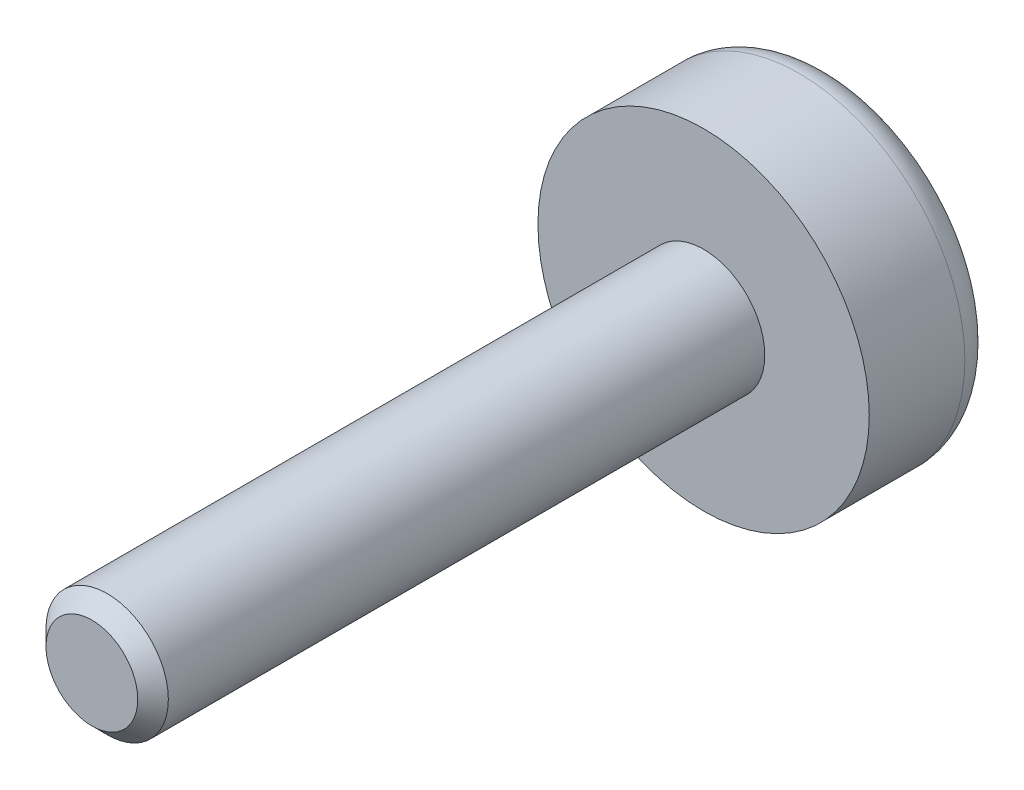
ISO-10303-21;
HEADER;
FILE_DESCRIPTION(('STEP AP214'),'2;1');
FILE_NAME('part.step','',(''),(''),'','','');
FILE_SCHEMA(('AUTOMOTIVE_DESIGN { 1 0 10303 214 1 1 1 1 }'));
ENDSEC;
DATA;
#1=APPLICATION_CONTEXT('core data for automotive mechanical design processes');
#2=APPLICATION_PROTOCOL_DEFINITION('international standard','automotive_design',2000,#1);
#3=PRODUCT_CONTEXT('',#1,'mechanical');
#4=PRODUCT('Part','Part','',(#3));
#5=PRODUCT_RELATED_PRODUCT_CATEGORY('part','',(#4));
#6=PRODUCT_DEFINITION_FORMATION('','',#4);
#7=PRODUCT_DEFINITION_CONTEXT('part definition',#1,'design');
#8=PRODUCT_DEFINITION('design','',#6,#7);
#9=PRODUCT_DEFINITION_SHAPE('','',#8);
#10=(LENGTH_UNIT() NAMED_UNIT(*) SI_UNIT(.MILLI.,.METRE.));
#11=(NAMED_UNIT(*) PLANE_ANGLE_UNIT() SI_UNIT($,.RADIAN.));
#12=(NAMED_UNIT(*) SI_UNIT($,.STERADIAN.) SOLID_ANGLE_UNIT());
#13=UNCERTAINTY_MEASURE_WITH_UNIT(LENGTH_MEASURE(1.E-05),#10,'distance_accuracy_value','');
#14=(GEOMETRIC_REPRESENTATION_CONTEXT(3) GLOBAL_UNCERTAINTY_ASSIGNED_CONTEXT((#13)) GLOBAL_UNIT_ASSIGNED_CONTEXT((#10,
#11,#12)) REPRESENTATION_CONTEXT('',''));
#15=CARTESIAN_POINT('',(0.,0.,0.));
#16=DIRECTION('',(0.,0.,1.));
#17=DIRECTION('',(1.,0.,0.));
#18=AXIS2_PLACEMENT_3D('',#15,#16,#17);
#19=CARTESIAN_POINT('',(0.,0.,12.));
#20=DIRECTION('',(0.,0.,1.));
#21=DIRECTION('',(-1.,0.,0.));
#22=AXIS2_PLACEMENT_3D('',#19,#20,#21);
#23=PLANE('',#22);
#24=CARTESIAN_POINT('',(0.,0.,12.));
#25=DIRECTION('',(0.,0.,-1.));
#26=DIRECTION('',(-1.,0.,0.));
#27=AXIS2_PLACEMENT_3D('',#24,#25,#26);
#28=CIRCLE('',#27,0.899999999999995);
#29=CARTESIAN_POINT('',(0.899999999999993,0.,12.));
#30=VERTEX_POINT('',#29);
#31=EDGE_CURVE('E140',#30,#30,#28,.T.);
#32=ORIENTED_EDGE('',*,*,#31,.F.);
#33=EDGE_LOOP('',(#32));
#34=FACE_BOUND('',#33,.T.);
#35=ADVANCED_FACE('F41',(#34),#23,.T.);
#36=CARTESIAN_POINT('',(0.,0.,-10.123));
#37=DIRECTION('',(0.,0.,-1.));
#38=DIRECTION('',(1.,0.,0.));
#39=AXIS2_PLACEMENT_3D('',#36,#37,#38);
#40=CYLINDRICAL_SURFACE('',#39,1.2);
#41=CARTESIAN_POINT('',(0.,0.,11.7));
#42=DIRECTION('',(0.,0.,-1.));
#43=DIRECTION('',(-1.,0.,0.));
#44=AXIS2_PLACEMENT_3D('',#41,#42,#43);
#45=CIRCLE('',#44,1.2);
#46=CARTESIAN_POINT('',(1.2,0.,11.7));
#47=VERTEX_POINT('',#46);
#48=EDGE_CURVE('E137',#47,#47,#45,.F.);
#49=ORIENTED_EDGE('',*,*,#48,.F.);
#50=EDGE_LOOP('',(#49));
#51=FACE_BOUND('',#50,.T.);
#52=CARTESIAN_POINT('',(0.,0.,0.));
#53=DIRECTION('',(0.,0.,1.));
#54=DIRECTION('',(1.,0.,0.));
#55=AXIS2_PLACEMENT_3D('',#52,#53,#54);
#56=CIRCLE('',#55,1.2);
#57=CARTESIAN_POINT('',(1.2,0.,0.));
#58=VERTEX_POINT('',#57);
#59=EDGE_CURVE('E134',#58,#58,#56,.T.);
#60=ORIENTED_EDGE('',*,*,#59,.T.);
#61=EDGE_LOOP('',(#60));
#62=FACE_BOUND('',#61,.T.);
#63=ADVANCED_FACE('F163',(#51,#62),#40,.T.);
#64=CARTESIAN_POINT('',(1.2,0.,0.));
#65=DIRECTION('',(0.,0.,1.));
#66=DIRECTION('',(-1.,0.,0.));
#67=AXIS2_PLACEMENT_3D('',#64,#65,#66);
#68=PLANE('',#67);
#69=ORIENTED_EDGE('',*,*,#59,.F.);
#70=EDGE_LOOP('',(#69));
#71=FACE_BOUND('',#70,.T.);
#72=CARTESIAN_POINT('',(0.,0.,0.));
#73=DIRECTION('',(0.,0.,1.));
#74=DIRECTION('',(1.,0.,0.));
#75=AXIS2_PLACEMENT_3D('',#72,#73,#74);
#76=CIRCLE('',#75,3.25);
#77=CARTESIAN_POINT('',(3.25,0.,0.));
#78=VERTEX_POINT('',#77);
#79=EDGE_CURVE('E131',#78,#78,#76,.T.);
#80=ORIENTED_EDGE('',*,*,#79,.T.);
#81=EDGE_LOOP('',(#80));
#82=FACE_BOUND('',#81,.T.);
#83=ADVANCED_FACE('F157',(#71,#82),#68,.T.);
#84=CARTESIAN_POINT('',(0.,0.,-10.123));
#85=DIRECTION('',(0.,0.,-1.));
#86=DIRECTION('',(1.,0.,0.));
#87=AXIS2_PLACEMENT_3D('',#84,#85,#86);
#88=CYLINDRICAL_SURFACE('',#87,3.25);
#89=CARTESIAN_POINT('',(0.,0.,-1.875));
#90=DIRECTION('',(0.,0.,1.));
#91=DIRECTION('',(1.,0.,0.));
#92=AXIS2_PLACEMENT_3D('',#89,#90,#91);
#93=CIRCLE('',#92,3.25);
#94=CARTESIAN_POINT('',(3.25,0.,-1.875));
#95=VERTEX_POINT('',#94);
#96=EDGE_CURVE('E11',#95,#95,#93,.F.);
#97=ORIENTED_EDGE('',*,*,#96,.F.);
#98=EDGE_LOOP('',(#97));
#99=FACE_BOUND('',#98,.T.);
#100=ORIENTED_EDGE('',*,*,#79,.F.);
#101=EDGE_LOOP('',(#100));
#102=FACE_BOUND('',#101,.T.);
#103=ADVANCED_FACE('F149',(#99,#102),#88,.T.);
#104=CARTESIAN_POINT('',(3.25,0.,-2.5));
#105=DIRECTION('',(0.,0.,-1.));
#106=DIRECTION('',(1.,0.,0.));
#107=AXIS2_PLACEMENT_3D('',#104,#105,#106);
#108=PLANE('',#107);
#109=DIRECTION('',(0.499999999999995,0.866025403784441,0.));
#110=VECTOR('',#109,1.);
#111=CARTESIAN_POINT('',(0.577350269189637,-0.999999999999993,-2.5));
#112=LINE('',#111,#110);
#113=CARTESIAN_POINT('',(0.577350269189637,-0.999999999999993,-2.5));
#114=VERTEX_POINT('',#113);
#115=CARTESIAN_POINT('',(1.15470053837925,0.,-2.5));
#116=VERTEX_POINT('',#115);
#117=EDGE_CURVE('E315',#114,#116,#112,.T.);
#118=ORIENTED_EDGE('',*,*,#117,.T.);
#119=DIRECTION('',(-0.500000000000001,0.866025403784438,0.));
#120=VECTOR('',#119,1.);
#121=CARTESIAN_POINT('',(1.15470053837925,0.,-2.5));
#122=LINE('',#121,#120);
#123=CARTESIAN_POINT('',(0.577350269189624,1.,-2.5));
#124=VERTEX_POINT('',#123);
#125=EDGE_CURVE('E310',#116,#124,#122,.T.);
#126=ORIENTED_EDGE('',*,*,#125,.T.);
#127=DIRECTION('',(-1.,0.,0.));
#128=VECTOR('',#127,1.);
#129=CARTESIAN_POINT('',(0.577350269189624,1.,-2.5));
#130=LINE('',#129,#128);
#131=CARTESIAN_POINT('',(-0.57735026918963,0.999999999999998,-2.5));
#132=VERTEX_POINT('',#131);
#133=EDGE_CURVE('E314',#124,#132,#130,.T.);
#134=ORIENTED_EDGE('',*,*,#133,.T.);
#135=DIRECTION('',(-0.499999999999995,-0.866025403784442,0.));
#136=VECTOR('',#135,1.);
#137=CARTESIAN_POINT('',(-0.57735026918963,0.999999999999998,-2.5));
#138=LINE('',#137,#136);
#139=CARTESIAN_POINT('',(-1.15470053837925,0.,-2.5));
#140=VERTEX_POINT('',#139);
#141=EDGE_CURVE('E322',#132,#140,#138,.T.);
#142=ORIENTED_EDGE('',*,*,#141,.T.);
#143=DIRECTION('',(0.500000000000007,-0.866025403784434,0.));
#144=VECTOR('',#143,1.);
#145=CARTESIAN_POINT('',(-1.15470053837925,0.,-2.5));
#146=LINE('',#145,#144);
#147=CARTESIAN_POINT('',(-0.577350269189617,-1.00000000000001,-2.5));
#148=VERTEX_POINT('',#147);
#149=EDGE_CURVE('E120',#140,#148,#146,.T.);
#150=ORIENTED_EDGE('',*,*,#149,.T.);
#151=DIRECTION('',(1.,0.,0.));
#152=VECTOR('',#151,1.);
#153=CARTESIAN_POINT('',(-0.577350269189617,-1.00000000000001,-2.5));
#154=LINE('',#153,#152);
#155=EDGE_CURVE('E317',#148,#114,#154,.T.);
#156=ORIENTED_EDGE('',*,*,#155,.T.);
#157=EDGE_LOOP('',(#118,#126,#134,#142,#150,#156));
#158=FACE_BOUND('',#157,.T.);
#159=CARTESIAN_POINT('',(0.,0.,-2.5));
#160=DIRECTION('',(0.,0.,1.));
#161=DIRECTION('',(1.,0.,0.));
#162=AXIS2_PLACEMENT_3D('',#159,#160,#161);
#163=CIRCLE('',#162,2.625);
#164=CARTESIAN_POINT('',(2.625,0.,-2.5));
#165=VERTEX_POINT('',#164);
#166=EDGE_CURVE('E49',#165,#165,#163,.T.);
#167=ORIENTED_EDGE('',*,*,#166,.F.);
#168=EDGE_LOOP('',(#167));
#169=FACE_BOUND('',#168,.T.);
#170=ADVANCED_FACE('F146',(#158,#169),#108,.T.);
#171=CARTESIAN_POINT('',(0.,0.,11.7));
#172=DIRECTION('',(0.,0.,-1.));
#173=DIRECTION('',(1.,0.,0.));
#174=AXIS2_PLACEMENT_3D('',#171,#172,#173);
#175=CONICAL_SURFACE('',#174,1.2,0.785398163397449);
#176=CARTESIAN_POINT('',(0.899999999999993,0.,12.));
#177=CARTESIAN_POINT('',(0.903124999999994,0.,11.996875));
#178=CARTESIAN_POINT('',(0.906249999999994,0.,11.99375));
#179=CARTESIAN_POINT('',(0.912499999999994,0.,11.9875));
#180=CARTESIAN_POINT('',(0.915624999999994,0.,11.984375));
#181=CARTESIAN_POINT('',(0.921874999999994,0.,11.978125));
#182=CARTESIAN_POINT('',(0.924999999999994,0.,11.975));
#183=CARTESIAN_POINT('',(0.931249999999994,0.,11.96875));
#184=CARTESIAN_POINT('',(0.934374999999994,0.,11.965625));
#185=CARTESIAN_POINT('',(0.940624999999994,0.,11.959375));
#186=CARTESIAN_POINT('',(0.943749999999994,0.,11.95625));
#187=CARTESIAN_POINT('',(0.949999999999994,0.,11.95));
#188=CARTESIAN_POINT('',(0.953124999999994,0.,11.946875));
#189=CARTESIAN_POINT('',(0.959374999999995,0.,11.940625));
#190=CARTESIAN_POINT('',(0.962499999999995,0.,11.9375));
#191=CARTESIAN_POINT('',(0.968749999999995,0.,11.93125));
#192=CARTESIAN_POINT('',(0.971874999999995,0.,11.928125));
#193=CARTESIAN_POINT('',(0.978124999999995,0.,11.921875));
#194=CARTESIAN_POINT('',(0.981249999999995,0.,11.91875));
#195=CARTESIAN_POINT('',(0.987499999999995,0.,11.9125));
#196=CARTESIAN_POINT('',(0.990624999999995,0.,11.909375));
#197=CARTESIAN_POINT('',(0.996874999999996,0.,11.903125));
#198=CARTESIAN_POINT('',(0.999999999999995,0.,11.9));
#199=CARTESIAN_POINT('',(1.00625,0.,11.89375));
#200=CARTESIAN_POINT('',(1.009375,0.,11.890625));
#201=CARTESIAN_POINT('',(1.015625,0.,11.884375));
#202=CARTESIAN_POINT('',(1.01875,0.,11.88125));
#203=CARTESIAN_POINT('',(1.025,0.,11.875));
#204=CARTESIAN_POINT('',(1.028125,0.,11.871875));
#205=CARTESIAN_POINT('',(1.034375,0.,11.865625));
#206=CARTESIAN_POINT('',(1.0375,0.,11.8625));
#207=CARTESIAN_POINT('',(1.04375,0.,11.85625));
#208=CARTESIAN_POINT('',(1.046875,0.,11.853125));
#209=CARTESIAN_POINT('',(1.053125,0.,11.846875));
#210=CARTESIAN_POINT('',(1.05625,0.,11.84375));
#211=CARTESIAN_POINT('',(1.0625,0.,11.8375));
#212=CARTESIAN_POINT('',(1.065625,0.,11.834375));
#213=CARTESIAN_POINT('',(1.071875,0.,11.828125));
#214=CARTESIAN_POINT('',(1.075,0.,11.825));
#215=CARTESIAN_POINT('',(1.08125,0.,11.81875));
#216=CARTESIAN_POINT('',(1.084375,0.,11.815625));
#217=CARTESIAN_POINT('',(1.090625,0.,11.809375));
#218=CARTESIAN_POINT('',(1.09375,0.,11.80625));
#219=CARTESIAN_POINT('',(1.1,0.,11.8));
#220=CARTESIAN_POINT('',(1.103125,0.,11.796875));
#221=CARTESIAN_POINT('',(1.109375,0.,11.790625));
#222=CARTESIAN_POINT('',(1.1125,0.,11.7875));
#223=CARTESIAN_POINT('',(1.11875,0.,11.78125));
#224=CARTESIAN_POINT('',(1.121875,0.,11.778125));
#225=CARTESIAN_POINT('',(1.128125,0.,11.771875));
#226=CARTESIAN_POINT('',(1.13125,0.,11.76875));
#227=CARTESIAN_POINT('',(1.1375,0.,11.7625));
#228=CARTESIAN_POINT('',(1.140625,0.,11.759375));
#229=CARTESIAN_POINT('',(1.146875,0.,11.753125));
#230=CARTESIAN_POINT('',(1.15,0.,11.75));
#231=CARTESIAN_POINT('',(1.15625,0.,11.74375));
#232=CARTESIAN_POINT('',(1.159375,0.,11.740625));
#233=CARTESIAN_POINT('',(1.165625,0.,11.734375));
#234=CARTESIAN_POINT('',(1.16875,0.,11.73125));
#235=CARTESIAN_POINT('',(1.175,0.,11.725));
#236=CARTESIAN_POINT('',(1.178125,0.,11.721875));
#237=CARTESIAN_POINT('',(1.184375,0.,11.715625));
#238=CARTESIAN_POINT('',(1.1875,0.,11.7125));
#239=CARTESIAN_POINT('',(1.19375,0.,11.70625));
#240=CARTESIAN_POINT('',(1.196875,0.,11.703125));
#241=CARTESIAN_POINT('',(1.2,0.,11.7));
#242=B_SPLINE_CURVE_WITH_KNOTS('',3,(#176,#177,#178,#179,#180,#181,#182,#183,#184,#185,#186,
#187,#188,#189,#190,#191,#192,#193,#194,#195,#196,#197,#198,#199,#200,#201,#202,#203,#204,#205,
#206,#207,#208,#209,#210,#211,#212,#213,#214,#215,#216,#217,#218,#219,#220,#221,#222,#223,#224,
#225,#226,#227,#228,#229,#230,#231,#232,#233,#234,#235,#236,#237,#238,#239,#240,#241),
.UNSPECIFIED.,.F.,.F.,(4,2,2,2,2,2,2,2,2,2,2,2,2,2,2,2,2,2,2,2,2,2,2,2,2,2,2,2,2,2,2,2,4),(0.,
0.0132582521472485,0.0265165042944968,0.0397747564417452,0.0530330085889924,0.0662912607362407,
0.0795495128834891,0.0928077650307363,0.106066017177985,0.119324269325233,0.13258252147248,
0.145840773619729,0.159099025766977,0.172357277914224,0.185615530061472,0.198873782208721,
0.212132034355968,0.225390286503216,0.238648538650465,0.251906790797713,0.26516504294496,
0.278423295092209,0.291681547239457,0.304939799386704,0.318198051533953,0.331456303681201,
0.344714555828448,0.357972807975697,0.371231060122945,0.384489312270192,0.397747564417441,
0.411005816564689,0.424264068711937),.UNSPECIFIED.);
#243=EDGE_CURVE('BSEAM148',#30,#47,#242,.T.);
#244=ORIENTED_EDGE('',*,*,#31,.T.);
#245=ORIENTED_EDGE('',*,*,#48,.T.);
#246=ORIENTED_EDGE('',*,*,#243,.T.);
#247=ORIENTED_EDGE('',*,*,#243,.F.);
#248=EDGE_LOOP('',(#244,#246,#245,#247));
#249=FACE_BOUND('',#248,.T.);
#250=ADVANCED_FACE('F148',(#249),#175,.T.);
#251=CARTESIAN_POINT('',(0.,0.,-1.875));
#252=DIRECTION('',(0.,0.,-1.));
#253=DIRECTION('',(1.,0.,0.));
#254=AXIS2_PLACEMENT_3D('',#251,#252,#253);
#255=TOROIDAL_SURFACE('',#254,2.625,0.625);
#256=ORIENTED_EDGE('',*,*,#96,.T.);
#257=EDGE_LOOP('',(#256));
#258=FACE_BOUND('',#257,.T.);
#259=ORIENTED_EDGE('',*,*,#166,.T.);
#260=EDGE_LOOP('',(#259));
#261=FACE_BOUND('',#260,.T.);
#262=ADVANCED_FACE('F43',(#258,#261),#255,.T.);
#263=CARTESIAN_POINT('',(0.577350269189637,-0.999999999999993,-1.125));
#264=DIRECTION('',(0.866025403784441,-0.499999999999995,0.));
#265=DIRECTION('',(0.499999999999995,0.866025403784441,0.));
#266=AXIS2_PLACEMENT_3D('',#263,#264,#265);
#267=PLANE('',#266);
#268=ORIENTED_EDGE('',*,*,#117,.F.);
#269=DIRECTION('',(0.,0.,-1.));
#270=VECTOR('',#269,1.);
#271=CARTESIAN_POINT('',(0.577350269189637,-0.999999999999993,-1.125));
#272=LINE('',#271,#270);
#273=CARTESIAN_POINT('',(0.577350269189637,-0.999999999999993,-1.125));
#274=VERTEX_POINT('',#273);
#275=EDGE_CURVE('E87',#274,#114,#272,.T.);
#276=ORIENTED_EDGE('',*,*,#275,.F.);
#277=DIRECTION('',(0.499999999999995,0.866025403784441,0.));
#278=VECTOR('',#277,1.);
#279=CARTESIAN_POINT('',(0.577350269189637,-0.999999999999993,-1.125));
#280=LINE('',#279,#278);
#281=CARTESIAN_POINT('',(1.15470053837925,0.,-1.125));
#282=VERTEX_POINT('',#281);
#283=EDGE_CURVE('E325',#274,#282,#280,.T.);
#284=ORIENTED_EDGE('',*,*,#283,.T.);
#285=DIRECTION('',(0.,0.,-1.));
#286=VECTOR('',#285,1.);
#287=CARTESIAN_POINT('',(1.15470053837925,0.,-1.125));
#288=LINE('',#287,#286);
#289=EDGE_CURVE('E56',#282,#116,#288,.T.);
#290=ORIENTED_EDGE('',*,*,#289,.T.);
#291=EDGE_LOOP('',(#268,#276,#284,#290));
#292=FACE_BOUND('',#291,.T.);
#293=ADVANCED_FACE('F210',(#292),#267,.F.);
#294=CARTESIAN_POINT('',(-0.577350269189617,-1.00000000000001,-1.125));
#295=DIRECTION('',(0.,-1.,0.));
#296=DIRECTION('',(1.,0.,0.));
#297=AXIS2_PLACEMENT_3D('',#294,#295,#296);
#298=PLANE('',#297);
#299=ORIENTED_EDGE('',*,*,#155,.F.);
#300=DIRECTION('',(0.,0.,-1.));
#301=VECTOR('',#300,1.);
#302=CARTESIAN_POINT('',(-0.577350269189617,-1.00000000000001,-1.125));
#303=LINE('',#302,#301);
#304=CARTESIAN_POINT('',(-0.577350269189617,-1.00000000000001,-1.125));
#305=VERTEX_POINT('',#304);
#306=EDGE_CURVE('E122',#305,#148,#303,.T.);
#307=ORIENTED_EDGE('',*,*,#306,.F.);
#308=DIRECTION('',(1.,0.,0.));
#309=VECTOR('',#308,1.);
#310=CARTESIAN_POINT('',(-0.577350269189617,-1.00000000000001,-1.125));
#311=LINE('',#310,#309);
#312=EDGE_CURVE('E65',#305,#274,#311,.T.);
#313=ORIENTED_EDGE('',*,*,#312,.T.);
#314=ORIENTED_EDGE('',*,*,#275,.T.);
#315=EDGE_LOOP('',(#299,#307,#313,#314));
#316=FACE_BOUND('',#315,.T.);
#317=ADVANCED_FACE('F220',(#316),#298,.F.);
#318=CARTESIAN_POINT('',(-1.15470053837925,0.,-1.125));
#319=DIRECTION('',(-0.866025403784435,-0.500000000000007,0.));
#320=DIRECTION('',(0.500000000000007,-0.866025403784435,0.));
#321=AXIS2_PLACEMENT_3D('',#318,#319,#320);
#322=PLANE('',#321);
#323=ORIENTED_EDGE('',*,*,#149,.F.);
#324=DIRECTION('',(0.,0.,-1.));
#325=VECTOR('',#324,1.);
#326=CARTESIAN_POINT('',(-1.15470053837925,0.,-1.125));
#327=LINE('',#326,#325);
#328=CARTESIAN_POINT('',(-1.15470053837925,0.,-1.125));
#329=VERTEX_POINT('',#328);
#330=EDGE_CURVE('E109',#329,#140,#327,.T.);
#331=ORIENTED_EDGE('',*,*,#330,.F.);
#332=DIRECTION('',(0.500000000000007,-0.866025403784434,0.));
#333=VECTOR('',#332,1.);
#334=CARTESIAN_POINT('',(-1.15470053837925,0.,-1.125));
#335=LINE('',#334,#333);
#336=EDGE_CURVE('E112',#329,#305,#335,.T.);
#337=ORIENTED_EDGE('',*,*,#336,.T.);
#338=ORIENTED_EDGE('',*,*,#306,.T.);
#339=EDGE_LOOP('',(#323,#331,#337,#338));
#340=FACE_BOUND('',#339,.T.);
#341=ADVANCED_FACE('F118',(#340),#322,.F.);
#342=CARTESIAN_POINT('',(-0.57735026918963,0.999999999999998,-1.125));
#343=DIRECTION('',(-0.866025403784442,0.499999999999995,0.));
#344=DIRECTION('',(-0.499999999999995,-0.866025403784441,0.));
#345=AXIS2_PLACEMENT_3D('',#342,#343,#344);
#346=PLANE('',#345);
#347=ORIENTED_EDGE('',*,*,#141,.F.);
#348=DIRECTION('',(0.,0.,-1.));
#349=VECTOR('',#348,1.);
#350=CARTESIAN_POINT('',(-0.57735026918963,0.999999999999998,-1.125));
#351=LINE('',#350,#349);
#352=CARTESIAN_POINT('',(-0.57735026918963,0.999999999999998,-1.125));
#353=VERTEX_POINT('',#352);
#354=EDGE_CURVE('E111',#353,#132,#351,.T.);
#355=ORIENTED_EDGE('',*,*,#354,.F.);
#356=DIRECTION('',(-0.499999999999995,-0.866025403784442,0.));
#357=VECTOR('',#356,1.);
#358=CARTESIAN_POINT('',(-0.57735026918963,0.999999999999998,-1.125));
#359=LINE('',#358,#357);
#360=EDGE_CURVE('E104',#353,#329,#359,.T.);
#361=ORIENTED_EDGE('',*,*,#360,.T.);
#362=ORIENTED_EDGE('',*,*,#330,.T.);
#363=EDGE_LOOP('',(#347,#355,#361,#362));
#364=FACE_BOUND('',#363,.T.);
#365=ADVANCED_FACE('F107',(#364),#346,.F.);
#366=CARTESIAN_POINT('',(0.577350269189624,1.,-1.125));
#367=DIRECTION('',(0.,1.,0.));
#368=DIRECTION('',(-1.,0.,0.));
#369=AXIS2_PLACEMENT_3D('',#366,#367,#368);
#370=PLANE('',#369);
#371=ORIENTED_EDGE('',*,*,#133,.F.);
#372=DIRECTION('',(0.,0.,-1.));
#373=VECTOR('',#372,1.);
#374=CARTESIAN_POINT('',(0.577350269189624,1.,-1.125));
#375=LINE('',#374,#373);
#376=CARTESIAN_POINT('',(0.577350269189624,1.,-1.125));
#377=VERTEX_POINT('',#376);
#378=EDGE_CURVE('E125',#377,#124,#375,.T.);
#379=ORIENTED_EDGE('',*,*,#378,.F.);
#380=DIRECTION('',(-1.,0.,0.));
#381=VECTOR('',#380,1.);
#382=CARTESIAN_POINT('',(0.577350269189624,1.,-1.125));
#383=LINE('',#382,#381);
#384=EDGE_CURVE('E113',#377,#353,#383,.T.);
#385=ORIENTED_EDGE('',*,*,#384,.T.);
#386=ORIENTED_EDGE('',*,*,#354,.T.);
#387=EDGE_LOOP('',(#371,#379,#385,#386));
#388=FACE_BOUND('',#387,.T.);
#389=ADVANCED_FACE('F247',(#388),#370,.F.);
#390=CARTESIAN_POINT('',(1.15470053837925,0.,-1.125));
#391=DIRECTION('',(0.866025403784438,0.500000000000001,0.));
#392=DIRECTION('',(-0.500000000000001,0.866025403784438,0.));
#393=AXIS2_PLACEMENT_3D('',#390,#391,#392);
#394=PLANE('',#393);
#395=ORIENTED_EDGE('',*,*,#125,.F.);
#396=ORIENTED_EDGE('',*,*,#289,.F.);
#397=DIRECTION('',(-0.500000000000001,0.866025403784438,0.));
#398=VECTOR('',#397,1.);
#399=CARTESIAN_POINT('',(1.15470053837925,0.,-1.125));
#400=LINE('',#399,#398);
#401=EDGE_CURVE('E95',#282,#377,#400,.T.);
#402=ORIENTED_EDGE('',*,*,#401,.T.);
#403=ORIENTED_EDGE('',*,*,#378,.T.);
#404=EDGE_LOOP('',(#395,#396,#402,#403));
#405=FACE_BOUND('',#404,.T.);
#406=ADVANCED_FACE('F257',(#405),#394,.F.);
#407=CARTESIAN_POINT('',(0.,0.,-1.125));
#408=DIRECTION('',(0.,0.,-1.));
#409=DIRECTION('',(1.,0.,0.));
#410=AXIS2_PLACEMENT_3D('',#407,#408,#409);
#411=PLANE('',#410);
#412=ORIENTED_EDGE('',*,*,#283,.F.);
#413=ORIENTED_EDGE('',*,*,#312,.F.);
#414=ORIENTED_EDGE('',*,*,#336,.F.);
#415=ORIENTED_EDGE('',*,*,#360,.F.);
#416=ORIENTED_EDGE('',*,*,#384,.F.);
#417=ORIENTED_EDGE('',*,*,#401,.F.);
#418=EDGE_LOOP('',(#412,#413,#414,#415,#416,#417));
#419=FACE_BOUND('',#418,.T.);
#420=ADVANCED_FACE('F115',(#419),#411,.T.);
#421=CLOSED_SHELL('',(#35,#63,#83,#103,#170,#250,#262,#293,#317,#341,#365,#389,#406,#420));
#422=MANIFOLD_SOLID_BREP('B2',#421);
#423=ADVANCED_BREP_SHAPE_REPRESENTATION('',(#18,#422),#14);
#424=SHAPE_DEFINITION_REPRESENTATION(#9,#423);
ENDSEC;
END-ISO-10303-21;
